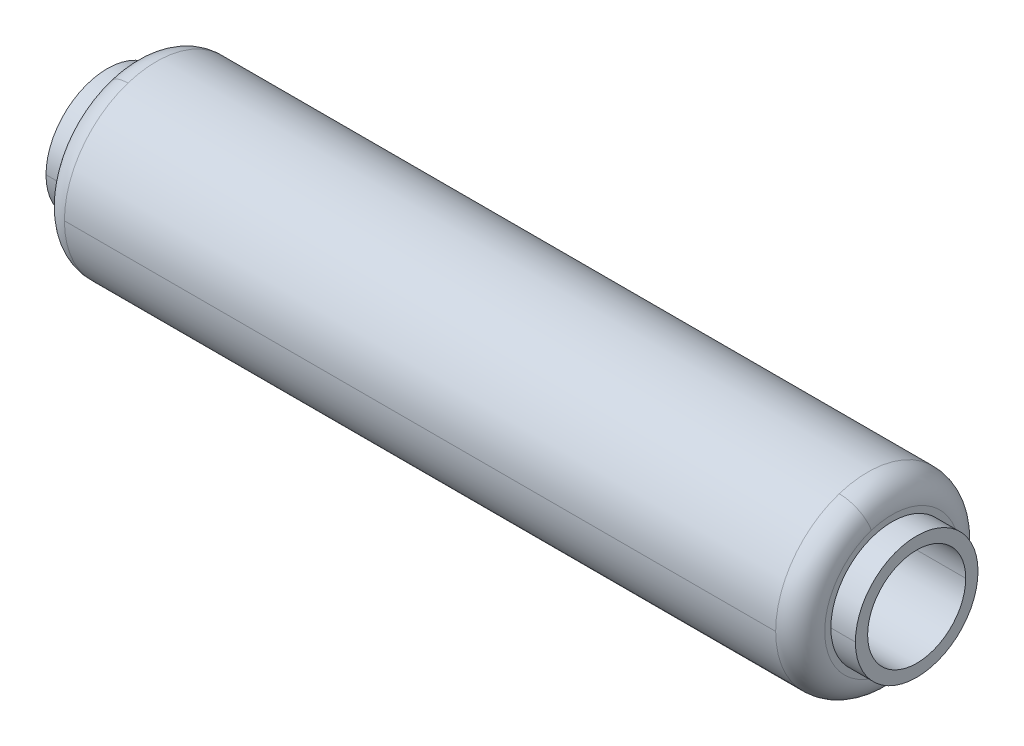
ISO-10303-21;
HEADER;
FILE_DESCRIPTION(('STEP AP214'),'2;1');
FILE_NAME('part.step','',(''),(''),'','','');
FILE_SCHEMA(('AUTOMOTIVE_DESIGN { 1 0 10303 214 1 1 1 1 }'));
ENDSEC;
DATA;
#1=APPLICATION_CONTEXT('core data for automotive mechanical design processes');
#2=APPLICATION_PROTOCOL_DEFINITION('international standard','automotive_design',2000,#1);
#3=PRODUCT_CONTEXT('',#1,'mechanical');
#4=PRODUCT('Part','Part','',(#3));
#5=PRODUCT_RELATED_PRODUCT_CATEGORY('part','',(#4));
#6=PRODUCT_DEFINITION_FORMATION('','',#4);
#7=PRODUCT_DEFINITION_CONTEXT('part definition',#1,'design');
#8=PRODUCT_DEFINITION('design','',#6,#7);
#9=PRODUCT_DEFINITION_SHAPE('','',#8);
#10=(LENGTH_UNIT() NAMED_UNIT(*) SI_UNIT(.MILLI.,.METRE.));
#11=(NAMED_UNIT(*) PLANE_ANGLE_UNIT() SI_UNIT($,.RADIAN.));
#12=(NAMED_UNIT(*) SI_UNIT($,.STERADIAN.) SOLID_ANGLE_UNIT());
#13=UNCERTAINTY_MEASURE_WITH_UNIT(LENGTH_MEASURE(1.E-05),#10,'distance_accuracy_value','');
#14=(GEOMETRIC_REPRESENTATION_CONTEXT(3) GLOBAL_UNCERTAINTY_ASSIGNED_CONTEXT((#13)) GLOBAL_UNIT_ASSIGNED_CONTEXT((#10,
#11,#12)) REPRESENTATION_CONTEXT('',''));
#15=CARTESIAN_POINT('',(0.,0.,0.));
#16=DIRECTION('',(0.,0.,1.));
#17=DIRECTION('',(1.,0.,0.));
#18=AXIS2_PLACEMENT_3D('',#15,#16,#17);
#19=CARTESIAN_POINT('',(0.,0.,0.));
#20=DIRECTION('',(1.,0.,0.));
#21=DIRECTION('',(0.,1.,0.));
#22=AXIS2_PLACEMENT_3D('',#19,#20,#21);
#23=CYLINDRICAL_SURFACE('',#22,5.);
#24=DIRECTION('',(1.,0.,0.));
#25=VECTOR('',#24,1.);
#26=CARTESIAN_POINT('',(-66.,0.,5.));
#27=LINE('',#26,#25);
#28=CARTESIAN_POINT('',(-66.,0.,5.));
#29=VERTEX_POINT('',#28);
#30=CARTESIAN_POINT('',(-64.,0.,5.));
#31=VERTEX_POINT('',#30);
#32=EDGE_CURVE('E11',#29,#31,#27,.T.);
#33=ORIENTED_EDGE('',*,*,#32,.F.);
#34=CARTESIAN_POINT('',(-66.,0.,0.));
#35=DIRECTION('',(1.,0.,0.));
#36=DIRECTION('',(0.,0.,-1.));
#37=AXIS2_PLACEMENT_3D('',#34,#35,#36);
#38=CIRCLE('',#37,5.);
#39=CARTESIAN_POINT('',(-66.,0.,-5.));
#40=VERTEX_POINT('',#39);
#41=EDGE_CURVE('E25',#29,#40,#38,.T.);
#42=ORIENTED_EDGE('',*,*,#41,.T.);
#43=DIRECTION('',(1.,0.,0.));
#44=VECTOR('',#43,1.);
#45=CARTESIAN_POINT('',(-66.,0.,-5.));
#46=LINE('',#45,#44);
#47=CARTESIAN_POINT('',(-64.,0.,-5.));
#48=VERTEX_POINT('',#47);
#49=EDGE_CURVE('E346',#40,#48,#46,.T.);
#50=ORIENTED_EDGE('',*,*,#49,.T.);
#51=CARTESIAN_POINT('',(-64.,0.,0.));
#52=DIRECTION('',(1.,0.,0.));
#53=DIRECTION('',(0.,0.,-1.));
#54=AXIS2_PLACEMENT_3D('',#51,#52,#53);
#55=CIRCLE('',#54,5.);
#56=EDGE_CURVE('E341',#31,#48,#55,.T.);
#57=ORIENTED_EDGE('',*,*,#56,.F.);
#58=EDGE_LOOP('',(#33,#42,#50,#57));
#59=FACE_BOUND('',#58,.T.);
#60=ADVANCED_FACE('F17',(#59),#23,.T.);
#61=CARTESIAN_POINT('',(-64.,5.5,0.));
#62=DIRECTION('',(-1.,0.,0.));
#63=DIRECTION('',(0.,0.,1.));
#64=AXIS2_PLACEMENT_3D('',#61,#62,#63);
#65=PLANE('',#64);
#66=CARTESIAN_POINT('',(-64.,0.,0.));
#67=DIRECTION('',(1.,0.,0.));
#68=DIRECTION('',(0.,0.,-1.));
#69=AXIS2_PLACEMENT_3D('',#66,#67,#68);
#70=CIRCLE('',#69,5.);
#71=EDGE_CURVE('E338',#48,#31,#70,.T.);
#72=ORIENTED_EDGE('',*,*,#71,.T.);
#73=ORIENTED_EDGE('',*,*,#56,.T.);
#74=EDGE_LOOP('',(#72,#73));
#75=FACE_BOUND('',#74,.T.);
#76=CARTESIAN_POINT('',(-64.0000000000001,-5.23081083962321,-1.69959346906218));
#77=CARTESIAN_POINT('',(-64.0000000000001,-5.20300309398906,-1.78518308762216));
#78=CARTESIAN_POINT('',(-64.0000000000001,-5.17309116338424,-1.87008884424513));
#79=CARTESIAN_POINT('',(-64.0000000000001,-5.10913883672672,-2.03833106983937));
#80=CARTESIAN_POINT('',(-64.0000000000001,-5.07509844067402,-2.12166753881065));
#81=CARTESIAN_POINT('',(-64.0000000000001,-5.00296908761421,-2.28656962532382));
#82=CARTESIAN_POINT('',(-64.0000000000001,-4.9648801306071,-2.36813524286571));
#83=CARTESIAN_POINT('',(-64.0000000000001,-4.88474597844831,-2.52929934187434));
#84=CARTESIAN_POINT('',(-64.0000000000001,-4.84270078329662,-2.60889782334107));
#85=CARTESIAN_POINT('',(-64.0000000000001,-4.7547552945039,-2.76593583312532));
#86=CARTESIAN_POINT('',(-64.0000000000001,-4.70885500086287,-2.84337536144283));
#87=CARTESIAN_POINT('',(-64.0000000000001,-4.61330993335347,-2.99590892169164));
#88=CARTESIAN_POINT('',(-64.0000000000001,-4.5636651594851,-3.07100295362294));
#89=CARTESIAN_POINT('',(-64.0000000000001,-4.46075071929532,-3.21866460888066));
#90=CARTESIAN_POINT('',(-64.0000000000001,-4.40748105297391,-3.29123223220707));
#91=CARTESIAN_POINT('',(-64.0000000000001,-4.29744516207313,-3.43366624959776));
#92=CARTESIAN_POINT('',(-64.0000000000001,-4.24067893749376,-3.50353264366202));
#93=CARTESIAN_POINT('',(-64.0000000000001,-4.12378668410636,-3.64039588796984));
#94=CARTESIAN_POINT('',(-64.0000000000001,-4.06366065529831,-3.70739273821339));
#95=CARTESIAN_POINT('',(-64.0000000000001,-3.9401936425318,-3.83835549367855));
#96=CARTESIAN_POINT('',(-64.0000000000001,-3.87685265857332,-3.90232139890016));
#97=CARTESIAN_POINT('',(-64.0000000000001,-3.74710832942847,-4.02706816483176));
#98=CARTESIAN_POINT('',(-64.0000000000001,-3.68070498424209,-4.08784902554176));
#99=CARTESIAN_POINT('',(-64.0000000000001,-3.54499590413118,-4.20607927603861));
#100=CARTESIAN_POINT('',(-64.0000000000001,-3.47569016920665,-4.26352866582546));
#101=CARTESIAN_POINT('',(-64.0000000000001,-3.33434327320134,-4.37495757386253));
#102=CARTESIAN_POINT('',(-64.0000000000001,-3.26230211212056,-4.42893709211274));
#103=CARTESIAN_POINT('',(-64.0000000000001,-3.11565791727092,-4.53329621568943));
#104=CARTESIAN_POINT('',(-64.0000000000001,-3.04105488350206,-4.5836758210159));
#105=CARTESIAN_POINT('',(-64.0000000000001,-2.88946666851878,-4.68071374986303));
#106=CARTESIAN_POINT('',(-64.0000000000001,-2.81248148730436,-4.72737207338368));
#107=CARTESIAN_POINT('',(-64.0000000000001,-2.65631444147469,-4.81685503463107));
#108=CARTESIAN_POINT('',(-64.0000000000001,-2.57713257685944,-4.85967967235779));
#109=CARTESIAN_POINT('',(-64.0000000000001,-2.41676292027544,-4.94139209371402));
#110=CARTESIAN_POINT('',(-64.0000000000001,-2.33557512830671,-4.98027987734352));
#111=CARTESIAN_POINT('',(-64.0000000000001,-2.17138920551782,-5.05402490642838));
#112=CARTESIAN_POINT('',(-64.0000000000001,-2.08839107469767,-5.08888215188373));
#113=CARTESIAN_POINT('',(-64.0000000000001,-1.92078442397287,-5.15448213046286));
#114=CARTESIAN_POINT('',(-64.0000000000001,-1.83617590406822,-5.18522486358662));
#115=CARTESIAN_POINT('',(-64.0000000000001,-1.66555230450972,-5.24252175556573));
#116=CARTESIAN_POINT('',(-64.0000000000001,-1.57953722485587,-5.26907591442108));
#117=CARTESIAN_POINT('',(-64.0000000000001,-1.40630772365986,-5.31793168656878));
#118=CARTESIAN_POINT('',(-64.0000000000001,-1.31909330211771,-5.34023329986115));
#119=CARTESIAN_POINT('',(-64.0000000000001,-1.1436752243257,-5.38053025434308));
#120=CARTESIAN_POINT('',(-64.0000000000001,-1.05547156807583,-5.39852559553266));
#121=CARTESIAN_POINT('',(-64.0000000000001,-0.878287511202014,-5.43016665345588));
#122=CARTESIAN_POINT('',(-64.0000000000001,-0.789307110578063,-5.44381237018953));
#123=CARTESIAN_POINT('',(-64.0000000000001,-0.610783926534943,-5.46672130547408));
#124=CARTESIAN_POINT('',(-64.0000000000001,-0.521241143115774,-5.47598452402497));
#125=CARTESIAN_POINT('',(-64.0000000000001,-0.341808909890495,-5.49010614703916));
#126=CARTESIAN_POINT('',(-64.0000000000001,-0.251919460084384,-5.49496455150244));
#127=CARTESIAN_POINT('',(-64.0000000000001,-0.0720104456431948,-5.50026484201951));
#128=CARTESIAN_POINT('',(-64.0000000000001,0.0180091189918844,-5.50070672807329));
#129=CARTESIAN_POINT('',(-64.0000000000001,0.197961498075026,-5.49717291722914));
#130=CARTESIAN_POINT('',(-64.0000000000001,0.287894312523088,-5.49319722033121));
#131=CARTESIAN_POINT('',(-64.0000000000001,0.467456535205006,-5.48083782138569));
#132=CARTESIAN_POINT('',(-64.0000000000001,0.557085943438861,-5.4724541193381));
#133=CARTESIAN_POINT('',(-64.0000000000001,0.73582542859732,-5.45129890716582));
#134=CARTESIAN_POINT('',(-64.0000000000001,0.824935505521924,-5.43852739704113));
#135=CARTESIAN_POINT('',(-64.0000000000001,1.00242165408145,-5.40862733640119));
#136=CARTESIAN_POINT('',(-64.0000000000001,1.09079772571637,-5.39149878588595));
#137=CARTESIAN_POINT('',(-64.0000000000001,1.26660295799913,-5.35292590864338));
#138=CARTESIAN_POINT('',(-64.0000000000001,1.35403211864697,-5.33148158191605));
#139=CARTESIAN_POINT('',(-64.0000000000001,1.52773290444967,-5.2843288135107));
#140=CARTESIAN_POINT('',(-64.0000000000001,1.61400452960454,-5.25862037183268));
#141=CARTESIAN_POINT('',(-64.0000000000001,1.7851824085198,-5.20300130741374));
#142=CARTESIAN_POINT('',(-64.0000000000001,1.87008866228019,-5.17309068467282));
#143=CARTESIAN_POINT('',(-64.0000000000001,2.03833125180428,-5.10913931543813));
#144=CARTESIAN_POINT('',(-64.0000000000001,2.12166758756799,-5.07509856894436));
#145=CARTESIAN_POINT('',(-64.0000000000001,2.28656957656645,-5.00296895934388));
#146=CARTESIAN_POINT('',(-64.0000000000001,2.3681352298012,-4.96488009623717));
#147=CARTESIAN_POINT('',(-64.0000000000001,2.52929935493882,-4.88474601281824));
#148=CARTESIAN_POINT('',(-64.0000000000001,2.60889782684168,-4.84270079250602));
#149=CARTESIAN_POINT('',(-64.0000000000001,2.76593582962468,-4.75475528529451));
#150=CARTESIAN_POINT('',(-64.0000000000001,2.84337536050483,-4.70885499839522));
#151=CARTESIAN_POINT('',(-64.0000000000001,2.99590892262962,-4.61330993582112));
#152=CARTESIAN_POINT('',(-64.0000000000001,3.07100295387426,-4.56366516014631));
#153=CARTESIAN_POINT('',(-64.0000000000001,3.21866460862931,-4.46075071863412));
#154=CARTESIAN_POINT('',(-64.0000000000001,3.29123223213972,-4.40748105279674));
#155=CARTESIAN_POINT('',(-64.0000000000001,3.43366624966509,-4.2974451622503));
#156=CARTESIAN_POINT('',(-64.0000000000001,3.50353264368005,-4.24067893754124));
#157=CARTESIAN_POINT('',(-64.0000000000001,3.64039588795178,-4.12378668405889));
#158=CARTESIAN_POINT('',(-64.0000000000001,3.70739273820855,-4.0636606552856));
#159=CARTESIAN_POINT('',(-64.0000000000001,3.83835549368338,-3.94019364254453));
#160=CARTESIAN_POINT('',(-64.0000000000001,3.90232139890144,-3.87685265857674));
#161=CARTESIAN_POINT('',(-64.0000000000001,4.02706816483045,-3.74710832942507));
#162=CARTESIAN_POINT('',(-64.0000000000001,4.0878490255414,-3.68070498424118));
#163=CARTESIAN_POINT('',(-64.0000000000001,4.20607927603894,-3.5449959041321));
#164=CARTESIAN_POINT('',(-64.0000000000001,4.26352866582554,-3.4756901692069));
#165=CARTESIAN_POINT('',(-64.0000000000001,4.37495757386242,-3.33434327320111));
#166=CARTESIAN_POINT('',(-64.0000000000001,4.42893709211271,-3.2623021121205));
#167=CARTESIAN_POINT('',(-64.0000000000001,4.53329621568944,-3.115657917271));
#168=CARTESIAN_POINT('',(-64.0000000000001,4.5836758210159,-3.04105488350209));
#169=CARTESIAN_POINT('',(-64.0000000000001,4.68071374986301,-2.88946666851878));
#170=CARTESIAN_POINT('',(-64.0000000000001,4.72737207338367,-2.81248148730437));
#171=CARTESIAN_POINT('',(-64.0000000000001,4.81685503463106,-2.65631444147471));
#172=CARTESIAN_POINT('',(-64.0000000000001,4.85967967235778,-2.57713257685945));
#173=CARTESIAN_POINT('',(-64.0000000000001,4.94139209371401,-2.41676292027546));
#174=CARTESIAN_POINT('',(-64.0000000000001,4.98027987734351,-2.33557512830672));
#175=CARTESIAN_POINT('',(-64.0000000000001,5.05402490642838,-2.17138920551783));
#176=CARTESIAN_POINT('',(-64.0000000000001,5.08888215188374,-2.08839107469767));
#177=CARTESIAN_POINT('',(-64.0000000000001,5.15448213046283,-1.92078442397289));
#178=CARTESIAN_POINT('',(-64.0000000000001,5.18522486358655,-1.83617590406826));
#179=CARTESIAN_POINT('',(-64.0000000000001,5.24252175556579,-1.66555230450972));
#180=CARTESIAN_POINT('',(-64.0000000000001,5.26907591442132,-1.57953722485581));
#181=CARTESIAN_POINT('',(-64.0000000000001,5.31793168656852,-1.40630772365995));
#182=CARTESIAN_POINT('',(-64.0000000000001,5.3402332998602,-1.31909330211798));
#183=CARTESIAN_POINT('',(-64.0000000000001,5.38053025434402,-1.14367522432546));
#184=CARTESIAN_POINT('',(-64.0000000000001,5.39852559553617,-1.05547156807489));
#185=CARTESIAN_POINT('',(-64.0000000000001,5.43016665345236,-0.878287511202984));
#186=CARTESIAN_POINT('',(-64.0000000000001,5.4438123701764,-0.789307110581643));
#187=CARTESIAN_POINT('',(-64.0000000000001,5.46672130548721,-0.610783926531393));
#188=CARTESIAN_POINT('',(-64.0000000000001,5.47598452407398,-0.521241143102484));
#189=CARTESIAN_POINT('',(-64.0000000000001,5.49010614699014,-0.341808909903816));
#190=CARTESIAN_POINT('',(-64.0000000000001,5.49496455131952,-0.251919460134057));
#191=CARTESIAN_POINT('',(-64.0000000000001,5.50026484220243,-0.0720104455935592));
#192=CARTESIAN_POINT('',(-64.0000000000001,5.50070672875595,0.0180091191771794));
#193=CARTESIAN_POINT('',(-64.0000000000001,5.49717291654648,0.197961497889694));
#194=CARTESIAN_POINT('',(-64.0000000000001,5.4931972177835,0.287894311831471));
#195=CARTESIAN_POINT('',(-64.0000000000001,5.48083782393339,0.467456535896589));
#196=CARTESIAN_POINT('',(-64.0000000000001,5.47245412884627,0.557085946019932));
#197=CARTESIAN_POINT('',(-64.0000000000001,5.45129889765765,0.735825426016222));
#198=CARTESIAN_POINT('',(-64.0000000000001,5.43852736155615,0.824935495889169));
#199=CARTESIAN_POINT('',(-64.0000000000001,5.40862737188617,1.00242166371418));
#200=CARTESIAN_POINT('',(-64.0000000000001,5.39149891831769,1.09079776166624));
#201=CARTESIAN_POINT('',(-64.0000000000001,5.35292577621164,1.26660292204923));
#202=CARTESIAN_POINT('',(-64.0000000000001,5.33148108767408,1.35403198448016));
#203=CARTESIAN_POINT('',(-64.0000000000001,5.28432930775267,1.52773303861645));
#204=CARTESIAN_POINT('',(-64.0000000000001,5.25862221636882,1.6140050303218));
#205=CARTESIAN_POINT('',(-64.0000000000001,5.23081083962322,1.69959346906215));
#206=B_SPLINE_CURVE_WITH_KNOTS('',3,(#76,#77,#78,#79,#80,#81,#82,#83,#84,#85,#86,#87,#88,#89,
#90,#91,#92,#93,#94,#95,#96,#97,#98,#99,#100,#101,#102,#103,#104,#105,#106,#107,#108,#109,#110,
#111,#112,#113,#114,#115,#116,#117,#118,#119,#120,#121,#122,#123,#124,#125,#126,#127,#128,#129,
#130,#131,#132,#133,#134,#135,#136,#137,#138,#139,#140,#141,#142,#143,#144,#145,#146,#147,#148,
#149,#150,#151,#152,#153,#154,#155,#156,#157,#158,#159,#160,#161,#162,#163,#164,#165,#166,#167,
#168,#169,#170,#171,#172,#173,#174,#175,#176,#177,#178,#179,#180,#181,#182,#183,#184,#185,#186,
#187,#188,#189,#190,#191,#192,#193,#194,#195,#196,#197,#198,#199,#200,#201,#202,#203,#204,#205),
.UNSPECIFIED.,.F.,.F.,(4,2,2,2,2,2,2,2,2,2,2,2,2,2,2,2,2,2,2,2,2,2,2,2,2,2,2,2,2,2,2,2,2,2,2,2,
2,2,2,2,2,2,2,2,2,2,2,2,2,2,2,2,2,2,2,2,2,2,2,2,2,2,2,2,4),(0.,0.269953513752028,
0.539907027504057,0.809860541256084,1.07981405500811,1.34976756876014,1.61972108251217,
1.8896745962642,2.15962811001622,2.42958162376825,2.69953513752028,2.96948865127231,
3.23944216502434,3.50939567877636,3.77934919252839,4.04930270628042,4.31925622003245,
4.58920973378448,4.8591632475365,5.12911676128853,5.39907027504056,5.66902378879259,
5.93897730254462,6.20893081629664,6.47888433004867,6.7488378438007,7.01879135755273,
7.28874487130475,7.55869838505678,7.82865189880881,8.09860541256084,8.36855892631287,
8.6385124400649,8.90846595381692,9.17841946756895,9.44837298132098,9.71832649507301,
9.98828000882503,10.2582335225771,10.5281870363291,10.7981405500811,11.0680940638331,
11.3380475775852,11.6080010913372,11.8779546050892,12.1479081188413,12.4178616325933,
12.6878151463453,12.9577686600973,13.2277221738494,13.4976756876014,13.7676292013534,
14.0375827151054,14.3075362288575,14.5774897426095,14.8474432563615,15.1173967701136,
15.3873502838656,15.6573037976176,15.9272573113696,16.1972108251217,16.4671643388737,
16.7371178526257,17.0070713663778,17.2770248801298),.UNSPECIFIED.);
#207=CARTESIAN_POINT('',(-64.0000000000001,-5.23081083962321,-1.69959346906217));
#208=VERTEX_POINT('',#207);
#209=CARTESIAN_POINT('',(-64.0000000000001,5.23081083962321,1.69959346906217));
#210=VERTEX_POINT('',#209);
#211=EDGE_CURVE('E337',#208,#210,#206,.T.);
#212=ORIENTED_EDGE('',*,*,#211,.F.);
#213=CARTESIAN_POINT('',(-64.0000000000001,5.23081083962321,1.69959346906218));
#214=CARTESIAN_POINT('',(-64.0000000000001,5.20300309398906,1.78518308762216));
#215=CARTESIAN_POINT('',(-64.0000000000001,5.17309116338424,1.87008884424513));
#216=CARTESIAN_POINT('',(-64.0000000000001,5.10913883672672,2.03833106983937));
#217=CARTESIAN_POINT('',(-64.0000000000001,5.07509844067402,2.12166753881065));
#218=CARTESIAN_POINT('',(-64.0000000000001,5.00296908761421,2.28656962532382));
#219=CARTESIAN_POINT('',(-64.0000000000001,4.9648801306071,2.36813524286571));
#220=CARTESIAN_POINT('',(-64.0000000000001,4.88474597844831,2.52929934187434));
#221=CARTESIAN_POINT('',(-64.0000000000001,4.84270078329662,2.60889782334107));
#222=CARTESIAN_POINT('',(-64.0000000000001,4.7547552945039,2.76593583312532));
#223=CARTESIAN_POINT('',(-64.0000000000001,4.70885500086287,2.84337536144284));
#224=CARTESIAN_POINT('',(-64.0000000000001,4.61330993335347,2.99590892169165));
#225=CARTESIAN_POINT('',(-64.0000000000001,4.5636651594851,3.07100295362294));
#226=CARTESIAN_POINT('',(-64.0000000000001,4.46075071929531,3.21866460888066));
#227=CARTESIAN_POINT('',(-64.0000000000001,4.4074810529739,3.29123223220708));
#228=CARTESIAN_POINT('',(-64.0000000000001,4.29744516207313,3.43366624959776));
#229=CARTESIAN_POINT('',(-64.0000000000001,4.24067893749376,3.50353264366202));
#230=CARTESIAN_POINT('',(-64.0000000000001,4.12378668410635,3.64039588796984));
#231=CARTESIAN_POINT('',(-64.0000000000001,4.06366065529831,3.7073927382134));
#232=CARTESIAN_POINT('',(-64.0000000000001,3.9401936425318,3.83835549367856));
#233=CARTESIAN_POINT('',(-64.0000000000001,3.87685265857332,3.90232139890016));
#234=CARTESIAN_POINT('',(-64.0000000000001,3.74710832942846,4.02706816483176));
#235=CARTESIAN_POINT('',(-64.0000000000001,3.68070498424208,4.08784902554176));
#236=CARTESIAN_POINT('',(-64.0000000000001,3.54499590413117,4.20607927603861));
#237=CARTESIAN_POINT('',(-64.0000000000001,3.47569016920665,4.26352866582546));
#238=CARTESIAN_POINT('',(-64.0000000000001,3.33434327320134,4.37495757386253));
#239=CARTESIAN_POINT('',(-64.0000000000001,3.26230211212056,4.42893709211274));
#240=CARTESIAN_POINT('',(-64.0000000000001,3.11565791727092,4.53329621568943));
#241=CARTESIAN_POINT('',(-64.0000000000001,3.04105488350206,4.5836758210159));
#242=CARTESIAN_POINT('',(-64.0000000000001,2.88946666851878,4.68071374986303));
#243=CARTESIAN_POINT('',(-64.0000000000001,2.81248148730436,4.72737207338369));
#244=CARTESIAN_POINT('',(-64.0000000000001,2.65631444147468,4.81685503463107));
#245=CARTESIAN_POINT('',(-64.0000000000001,2.57713257685943,4.85967967235779));
#246=CARTESIAN_POINT('',(-64.0000000000001,2.41676292027544,4.94139209371402));
#247=CARTESIAN_POINT('',(-64.0000000000001,2.3355751283067,4.98027987734352));
#248=CARTESIAN_POINT('',(-64.0000000000001,2.17138920551781,5.05402490642838));
#249=CARTESIAN_POINT('',(-64.0000000000001,2.08839107469766,5.08888215188373));
#250=CARTESIAN_POINT('',(-64.0000000000001,1.92078442397286,5.15448213046286));
#251=CARTESIAN_POINT('',(-64.0000000000001,1.83617590406822,5.18522486358663));
#252=CARTESIAN_POINT('',(-64.0000000000001,1.66555230450972,5.24252175556574));
#253=CARTESIAN_POINT('',(-64.0000000000001,1.57953722485586,5.26907591442108));
#254=CARTESIAN_POINT('',(-64.0000000000001,1.40630772365986,5.31793168656878));
#255=CARTESIAN_POINT('',(-64.0000000000001,1.31909330211771,5.34023329986115));
#256=CARTESIAN_POINT('',(-64.0000000000001,1.14367522432569,5.38053025434308));
#257=CARTESIAN_POINT('',(-64.0000000000001,1.05547156807582,5.39852559553266));
#258=CARTESIAN_POINT('',(-64.0000000000001,0.878287511202006,5.43016665345588));
#259=CARTESIAN_POINT('',(-64.0000000000001,0.789307110578055,5.44381237018953));
#260=CARTESIAN_POINT('',(-64.0000000000001,0.610783926534935,5.46672130547408));
#261=CARTESIAN_POINT('',(-64.0000000000001,0.521241143115766,5.47598452402498));
#262=CARTESIAN_POINT('',(-64.0000000000001,0.341808909890488,5.49010614703916));
#263=CARTESIAN_POINT('',(-64.0000000000001,0.251919460084378,5.49496455150245));
#264=CARTESIAN_POINT('',(-64.0000000000001,0.0720104456431886,5.50026484201951));
#265=CARTESIAN_POINT('',(-64.0000000000001,-0.0180091189918914,5.50070672807329));
#266=CARTESIAN_POINT('',(-64.0000000000001,-0.197961498075034,5.49717291722914));
#267=CARTESIAN_POINT('',(-64.0000000000001,-0.287894312523096,5.49319722033121));
#268=CARTESIAN_POINT('',(-64.0000000000001,-0.467456535205014,5.48083782138569));
#269=CARTESIAN_POINT('',(-64.0000000000001,-0.55708594343887,5.4724541193381));
#270=CARTESIAN_POINT('',(-64.0000000000001,-0.73582542859733,5.45129890716582));
#271=CARTESIAN_POINT('',(-64.0000000000001,-0.824935505521934,5.43852739704113));
#272=CARTESIAN_POINT('',(-64.0000000000001,-1.00242165408146,5.40862733640119));
#273=CARTESIAN_POINT('',(-64.0000000000001,-1.09079772571638,5.39149878588595));
#274=CARTESIAN_POINT('',(-64.0000000000001,-1.26660295799914,5.35292590864337));
#275=CARTESIAN_POINT('',(-64.0000000000001,-1.35403211864698,5.33148158191605));
#276=CARTESIAN_POINT('',(-64.0000000000001,-1.52773290444968,5.2843288135107));
#277=CARTESIAN_POINT('',(-64.0000000000001,-1.61400452960455,5.25862037183268));
#278=CARTESIAN_POINT('',(-64.0000000000001,-1.78518240851981,5.20300130741374));
#279=CARTESIAN_POINT('',(-64.0000000000001,-1.8700886622802,5.17309068467282));
#280=CARTESIAN_POINT('',(-64.0000000000001,-2.0383312518043,5.10913931543813));
#281=CARTESIAN_POINT('',(-64.0000000000001,-2.121667587568,5.07509856894436));
#282=CARTESIAN_POINT('',(-64.0000000000001,-2.28656957656646,5.00296895934388));
#283=CARTESIAN_POINT('',(-64.0000000000001,-2.36813522980121,4.96488009623717));
#284=CARTESIAN_POINT('',(-64.0000000000001,-2.52929935493883,4.88474601281824));
#285=CARTESIAN_POINT('',(-64.0000000000001,-2.60889782684169,4.84270079250602));
#286=CARTESIAN_POINT('',(-64.0000000000001,-2.76593582962469,4.7547552852945));
#287=CARTESIAN_POINT('',(-64.0000000000001,-2.84337536050484,4.70885499839522));
#288=CARTESIAN_POINT('',(-64.0000000000001,-2.99590892262963,4.61330993582112));
#289=CARTESIAN_POINT('',(-64.0000000000001,-3.07100295387427,4.5636651601463));
#290=CARTESIAN_POINT('',(-64.0000000000001,-3.21866460862932,4.46075071863411));
#291=CARTESIAN_POINT('',(-64.0000000000001,-3.29123223213973,4.40748105279674));
#292=CARTESIAN_POINT('',(-64.0000000000001,-3.4336662496651,4.2974451622503));
#293=CARTESIAN_POINT('',(-64.0000000000001,-3.50353264368006,4.24067893754123));
#294=CARTESIAN_POINT('',(-64.0000000000001,-3.64039588795179,4.12378668405888));
#295=CARTESIAN_POINT('',(-64.0000000000001,-3.70739273820855,4.06366065528559));
#296=CARTESIAN_POINT('',(-64.0000000000001,-3.83835549368339,3.94019364254452));
#297=CARTESIAN_POINT('',(-64.0000000000001,-3.90232139890145,3.87685265857673));
#298=CARTESIAN_POINT('',(-64.0000000000001,-4.02706816483046,3.74710832942506));
#299=CARTESIAN_POINT('',(-64.0000000000001,-4.08784902554141,3.68070498424117));
#300=CARTESIAN_POINT('',(-64.0000000000001,-4.20607927603895,3.54499590413209));
#301=CARTESIAN_POINT('',(-64.0000000000001,-4.26352866582555,3.47569016920689));
#302=CARTESIAN_POINT('',(-64.0000000000001,-4.37495757386243,3.3343432732011));
#303=CARTESIAN_POINT('',(-64.0000000000001,-4.42893709211271,3.26230211212049));
#304=CARTESIAN_POINT('',(-64.0000000000001,-4.53329621568945,3.11565791727098));
#305=CARTESIAN_POINT('',(-64.0000000000001,-4.5836758210159,3.04105488350208));
#306=CARTESIAN_POINT('',(-64.0000000000001,-4.68071374986302,2.88946666851876));
#307=CARTESIAN_POINT('',(-64.0000000000001,-4.72737207338368,2.81248148730436));
#308=CARTESIAN_POINT('',(-64.0000000000001,-4.81685503463107,2.65631444147469));
#309=CARTESIAN_POINT('',(-64.0000000000001,-4.85967967235779,2.57713257685944));
#310=CARTESIAN_POINT('',(-64.0000000000001,-4.94139209371401,2.41676292027544));
#311=CARTESIAN_POINT('',(-64.0000000000001,-4.98027987734351,2.33557512830671));
#312=CARTESIAN_POINT('',(-64.0000000000001,-5.05402490642838,2.17138920551781));
#313=CARTESIAN_POINT('',(-64.0000000000001,-5.08888215188375,2.08839107469766));
#314=CARTESIAN_POINT('',(-64.0000000000001,-5.15448213046283,1.92078442397287));
#315=CARTESIAN_POINT('',(-64.0000000000001,-5.18522486358655,1.83617590406824));
#316=CARTESIAN_POINT('',(-64.0000000000001,-5.2425217555658,1.6655523045097));
#317=CARTESIAN_POINT('',(-64.0000000000001,-5.26907591442133,1.5795372248558));
#318=CARTESIAN_POINT('',(-64.0000000000001,-5.31793168656853,1.40630772365993));
#319=CARTESIAN_POINT('',(-64.0000000000001,-5.3402332998602,1.31909330211797));
#320=CARTESIAN_POINT('',(-64.0000000000001,-5.38053025434402,1.14367522432544));
#321=CARTESIAN_POINT('',(-64.0000000000001,-5.39852559553617,1.05547156807488));
#322=CARTESIAN_POINT('',(-64.0000000000001,-5.43016665345236,0.878287511202967));
#323=CARTESIAN_POINT('',(-64.0000000000001,-5.4438123701764,0.789307110581624));
#324=CARTESIAN_POINT('',(-64.0000000000001,-5.46672130548721,0.610783926531373));
#325=CARTESIAN_POINT('',(-64.0000000000001,-5.47598452407399,0.521241143102464));
#326=CARTESIAN_POINT('',(-64.0000000000001,-5.49010614699014,0.341808909903796));
#327=CARTESIAN_POINT('',(-64.0000000000001,-5.49496455131953,0.251919460134037));
#328=CARTESIAN_POINT('',(-64.0000000000001,-5.50026484220243,0.0720104455935391));
#329=CARTESIAN_POINT('',(-64.0000000000001,-5.50070672875595,-0.0180091191771997));
#330=CARTESIAN_POINT('',(-64.0000000000001,-5.49717291654648,-0.197961497889715));
#331=CARTESIAN_POINT('',(-64.0000000000001,-5.4931972177835,-0.287894311831491));
#332=CARTESIAN_POINT('',(-64.0000000000001,-5.48083782393339,-0.46745653589661));
#333=CARTESIAN_POINT('',(-64.0000000000001,-5.47245412884627,-0.557085946019952));
#334=CARTESIAN_POINT('',(-64.0000000000001,-5.45129889765764,-0.735825426016242));
#335=CARTESIAN_POINT('',(-64.0000000000001,-5.43852736155615,-0.824935495889189));
#336=CARTESIAN_POINT('',(-64.0000000000001,-5.40862737188617,-1.0024216637142));
#337=CARTESIAN_POINT('',(-64.0000000000001,-5.39149891831768,-1.09079776166626));
#338=CARTESIAN_POINT('',(-64.0000000000001,-5.35292577621164,-1.26660292204925));
#339=CARTESIAN_POINT('',(-64.0000000000001,-5.33148108767408,-1.35403198448018));
#340=CARTESIAN_POINT('',(-64.0000000000001,-5.28432930775267,-1.52773303861647));
#341=CARTESIAN_POINT('',(-64.0000000000001,-5.25862221636882,-1.61400503032182));
#342=CARTESIAN_POINT('',(-64.0000000000001,-5.23081083962321,-1.69959346906217));
#343=B_SPLINE_CURVE_WITH_KNOTS('',3,(#213,#214,#215,#216,#217,#218,#219,#220,#221,#222,#223,
#224,#225,#226,#227,#228,#229,#230,#231,#232,#233,#234,#235,#236,#237,#238,#239,#240,#241,#242,
#243,#244,#245,#246,#247,#248,#249,#250,#251,#252,#253,#254,#255,#256,#257,#258,#259,#260,#261,
#262,#263,#264,#265,#266,#267,#268,#269,#270,#271,#272,#273,#274,#275,#276,#277,#278,#279,#280,
#281,#282,#283,#284,#285,#286,#287,#288,#289,#290,#291,#292,#293,#294,#295,#296,#297,#298,#299,
#300,#301,#302,#303,#304,#305,#306,#307,#308,#309,#310,#311,#312,#313,#314,#315,#316,#317,#318,
#319,#320,#321,#322,#323,#324,#325,#326,#327,#328,#329,#330,#331,#332,#333,#334,#335,#336,#337,
#338,#339,#340,#341,#342),.UNSPECIFIED.,.F.,.F.,(4,2,2,2,2,2,2,2,2,2,2,2,2,2,2,2,2,2,2,2,2,2,2,
2,2,2,2,2,2,2,2,2,2,2,2,2,2,2,2,2,2,2,2,2,2,2,2,2,2,2,2,2,2,2,2,2,2,2,2,2,2,2,2,2,4),(0.,
0.269953513752027,0.539907027504057,0.809860541256085,1.07981405500811,1.34976756876014,
1.61972108251217,1.8896745962642,2.15962811001623,2.42958162376826,2.69953513752028,
2.96948865127231,3.23944216502434,3.50939567877637,3.7793491925284,4.04930270628043,
4.31925622003245,4.58920973378448,4.85916324753651,5.12911676128854,5.39907027504056,
5.66902378879259,5.93897730254462,6.20893081629665,6.47888433004868,6.74883784380071,
7.01879135755273,7.28874487130476,7.55869838505679,7.82865189880882,8.09860541256085,
8.36855892631288,8.6385124400649,8.90846595381693,9.17841946756896,9.44837298132099,
9.71832649507301,9.98828000882505,10.2582335225771,10.5281870363291,10.7981405500811,
11.0680940638332,11.3380475775852,11.6080010913372,11.8779546050892,12.1479081188413,
12.4178616325933,12.6878151463453,12.9577686600973,13.2277221738494,13.4976756876014,
13.7676292013534,14.0375827151055,14.3075362288575,14.5774897426095,14.8474432563615,
15.1173967701136,15.3873502838656,15.6573037976176,15.9272573113697,16.1972108251217,
16.4671643388737,16.7371178526257,17.0070713663778,17.2770248801298),.UNSPECIFIED.);
#344=EDGE_CURVE('E299',#210,#208,#343,.T.);
#345=ORIENTED_EDGE('',*,*,#344,.F.);
#346=EDGE_LOOP('',(#212,#345));
#347=FACE_BOUND('',#346,.T.);
#348=ADVANCED_FACE('F285',(#75,#347),#65,.T.);
#349=CARTESIAN_POINT('',(-62.,0.,0.));
#350=DIRECTION('',(1.,0.,0.));
#351=DIRECTION('',(0.,0.309016994374947,-0.951056516295154));
#352=AXIS2_PLACEMENT_3D('',#349,#350,#351);
#353=TOROIDAL_SURFACE('',#352,5.49999999999986,2.00000000000014);
#354=CARTESIAN_POINT('',(-62.,-5.23081083962321,-1.69959346906217));
#355=DIRECTION('',(0.,0.309016994374947,-0.951056516295154));
#356=DIRECTION('',(0.,-0.951056516295154,-0.309016994374947));
#357=AXIS2_PLACEMENT_3D('',#354,#355,#356);
#358=CIRCLE('',#357,2.00000000000014);
#359=CARTESIAN_POINT('',(-62.,-7.13292387221365,-2.3176274578121));
#360=VERTEX_POINT('',#359);
#361=EDGE_CURVE('E311',#360,#208,#358,.T.);
#362=ORIENTED_EDGE('',*,*,#361,.F.);
#363=CARTESIAN_POINT('',(-62.,0.,0.));
#364=DIRECTION('',(1.,0.,0.));
#365=DIRECTION('',(0.,0.,-1.));
#366=AXIS2_PLACEMENT_3D('',#363,#364,#365);
#367=CIRCLE('',#366,7.5);
#368=CARTESIAN_POINT('',(-62.,0.,7.5));
#369=VERTEX_POINT('',#368);
#370=EDGE_CURVE('E306',#369,#360,#367,.T.);
#371=ORIENTED_EDGE('',*,*,#370,.F.);
#372=CARTESIAN_POINT('',(-62.,0.,0.));
#373=DIRECTION('',(1.,0.,0.));
#374=DIRECTION('',(0.,0.,-1.));
#375=AXIS2_PLACEMENT_3D('',#372,#373,#374);
#376=CIRCLE('',#375,7.5);
#377=CARTESIAN_POINT('',(-62.,7.13292387221365,2.3176274578121));
#378=VERTEX_POINT('',#377);
#379=EDGE_CURVE('E301',#378,#369,#376,.T.);
#380=ORIENTED_EDGE('',*,*,#379,.F.);
#381=CARTESIAN_POINT('',(-62.,5.23081083962321,1.69959346906217));
#382=DIRECTION('',(0.,-0.309016994374947,0.951056516295154));
#383=DIRECTION('',(0.,0.951056516295154,0.309016994374947));
#384=AXIS2_PLACEMENT_3D('',#381,#382,#383);
#385=CIRCLE('',#384,2.00000000000014);
#386=EDGE_CURVE('E261',#378,#210,#385,.T.);
#387=ORIENTED_EDGE('',*,*,#386,.T.);
#388=ORIENTED_EDGE('',*,*,#344,.T.);
#389=EDGE_LOOP('',(#362,#371,#380,#387,#388));
#390=FACE_BOUND('',#389,.T.);
#391=ADVANCED_FACE('F281',(#390),#353,.T.);
#392=CARTESIAN_POINT('',(-62.,0.,0.));
#393=DIRECTION('',(1.,0.,0.));
#394=DIRECTION('',(0.,-0.309016994374947,0.951056516295154));
#395=AXIS2_PLACEMENT_3D('',#392,#393,#394);
#396=TOROIDAL_SURFACE('',#395,5.49999999999986,2.00000000000014);
#397=ORIENTED_EDGE('',*,*,#361,.T.);
#398=ORIENTED_EDGE('',*,*,#211,.T.);
#399=ORIENTED_EDGE('',*,*,#386,.F.);
#400=CARTESIAN_POINT('',(-62.,0.,0.));
#401=DIRECTION('',(1.,0.,0.));
#402=DIRECTION('',(0.,0.,-1.));
#403=AXIS2_PLACEMENT_3D('',#400,#401,#402);
#404=CIRCLE('',#403,7.5);
#405=CARTESIAN_POINT('',(-62.,0.,-7.5));
#406=VERTEX_POINT('',#405);
#407=EDGE_CURVE('E256',#406,#378,#404,.T.);
#408=ORIENTED_EDGE('',*,*,#407,.F.);
#409=CARTESIAN_POINT('',(-62.,0.,0.));
#410=DIRECTION('',(1.,0.,0.));
#411=DIRECTION('',(0.,0.,-1.));
#412=AXIS2_PLACEMENT_3D('',#409,#410,#411);
#413=CIRCLE('',#412,7.5);
#414=EDGE_CURVE('E251',#360,#406,#413,.T.);
#415=ORIENTED_EDGE('',*,*,#414,.F.);
#416=EDGE_LOOP('',(#397,#398,#399,#408,#415));
#417=FACE_BOUND('',#416,.T.);
#418=ADVANCED_FACE('F270',(#417),#396,.T.);
#419=CARTESIAN_POINT('',(0.,0.,0.));
#420=DIRECTION('',(1.,0.,0.));
#421=DIRECTION('',(0.,1.,0.));
#422=AXIS2_PLACEMENT_3D('',#419,#420,#421);
#423=CYLINDRICAL_SURFACE('',#422,7.5);
#424=DIRECTION('',(1.,0.,0.));
#425=VECTOR('',#424,1.);
#426=CARTESIAN_POINT('',(-62.,0.,7.5));
#427=LINE('',#426,#425);
#428=CARTESIAN_POINT('',(-4.,0.,7.5));
#429=VERTEX_POINT('',#428);
#430=EDGE_CURVE('E246',#369,#429,#427,.T.);
#431=ORIENTED_EDGE('',*,*,#430,.F.);
#432=ORIENTED_EDGE('',*,*,#370,.T.);
#433=ORIENTED_EDGE('',*,*,#414,.T.);
#434=DIRECTION('',(1.,0.,0.));
#435=VECTOR('',#434,1.);
#436=CARTESIAN_POINT('',(-62.,0.,-7.5));
#437=LINE('',#436,#435);
#438=CARTESIAN_POINT('',(-4.,0.,-7.5));
#439=VERTEX_POINT('',#438);
#440=EDGE_CURVE('E242',#406,#439,#437,.T.);
#441=ORIENTED_EDGE('',*,*,#440,.T.);
#442=CARTESIAN_POINT('',(-4.,0.,0.));
#443=DIRECTION('',(1.,0.,0.));
#444=DIRECTION('',(0.,0.,-1.));
#445=AXIS2_PLACEMENT_3D('',#442,#443,#444);
#446=CIRCLE('',#445,7.5);
#447=CARTESIAN_POINT('',(-4.,-7.13292387221365,-2.3176274578121));
#448=VERTEX_POINT('',#447);
#449=EDGE_CURVE('E237',#448,#439,#446,.T.);
#450=ORIENTED_EDGE('',*,*,#449,.F.);
#451=CARTESIAN_POINT('',(-4.,0.,0.));
#452=DIRECTION('',(1.,0.,0.));
#453=DIRECTION('',(0.,0.,-1.));
#454=AXIS2_PLACEMENT_3D('',#451,#452,#453);
#455=CIRCLE('',#454,7.5);
#456=EDGE_CURVE('E232',#429,#448,#455,.T.);
#457=ORIENTED_EDGE('',*,*,#456,.F.);
#458=EDGE_LOOP('',(#431,#432,#433,#441,#450,#457));
#459=FACE_BOUND('',#458,.T.);
#460=ADVANCED_FACE('F280',(#459),#423,.T.);
#461=CARTESIAN_POINT('',(-4.,0.,0.));
#462=DIRECTION('',(1.,0.,0.));
#463=DIRECTION('',(0.,0.309016994374947,-0.951056516295154));
#464=AXIS2_PLACEMENT_3D('',#461,#462,#463);
#465=TOROIDAL_SURFACE('',#464,5.5,2.);
#466=CARTESIAN_POINT('',(-4.,-5.23081083962335,-1.69959346906221));
#467=DIRECTION('',(0.,0.309016994374947,-0.951056516295154));
#468=DIRECTION('',(1.,0.,0.));
#469=AXIS2_PLACEMENT_3D('',#466,#467,#468);
#470=CIRCLE('',#469,2.);
#471=CARTESIAN_POINT('',(-2.,-5.23081083962335,-1.69959346906221));
#472=VERTEX_POINT('',#471);
#473=EDGE_CURVE('E228',#472,#448,#470,.T.);
#474=ORIENTED_EDGE('',*,*,#473,.F.);
#475=CARTESIAN_POINT('',(-2.,0.,0.));
#476=DIRECTION('',(1.,0.,0.));
#477=DIRECTION('',(0.,0.,-1.));
#478=AXIS2_PLACEMENT_3D('',#475,#476,#477);
#479=CIRCLE('',#478,5.5);
#480=CARTESIAN_POINT('',(-2.,5.23081083962335,1.69959346906221));
#481=VERTEX_POINT('',#480);
#482=EDGE_CURVE('E224',#481,#472,#479,.T.);
#483=ORIENTED_EDGE('',*,*,#482,.F.);
#484=CARTESIAN_POINT('',(-4.,5.23081083962335,1.69959346906221));
#485=DIRECTION('',(0.,-0.309016994374947,0.951056516295154));
#486=DIRECTION('',(1.,0.,0.));
#487=AXIS2_PLACEMENT_3D('',#484,#485,#486);
#488=CIRCLE('',#487,2.);
#489=CARTESIAN_POINT('',(-4.,7.13292387221365,2.3176274578121));
#490=VERTEX_POINT('',#489);
#491=EDGE_CURVE('E220',#481,#490,#488,.T.);
#492=ORIENTED_EDGE('',*,*,#491,.T.);
#493=CARTESIAN_POINT('',(-4.,0.,0.));
#494=DIRECTION('',(1.,0.,0.));
#495=DIRECTION('',(0.,0.,-1.));
#496=AXIS2_PLACEMENT_3D('',#493,#494,#495);
#497=CIRCLE('',#496,7.5);
#498=EDGE_CURVE('E215',#490,#429,#497,.T.);
#499=ORIENTED_EDGE('',*,*,#498,.T.);
#500=ORIENTED_EDGE('',*,*,#456,.T.);
#501=EDGE_LOOP('',(#474,#483,#492,#499,#500));
#502=FACE_BOUND('',#501,.T.);
#503=ADVANCED_FACE('F400',(#502),#465,.T.);
#504=CARTESIAN_POINT('',(0.,0.,0.));
#505=DIRECTION('',(1.,0.,0.));
#506=DIRECTION('',(0.,-1.,0.));
#507=AXIS2_PLACEMENT_3D('',#504,#505,#506);
#508=CYLINDRICAL_SURFACE('',#507,7.5);
#509=ORIENTED_EDGE('',*,*,#430,.T.);
#510=ORIENTED_EDGE('',*,*,#498,.F.);
#511=CARTESIAN_POINT('',(-4.,0.,0.));
#512=DIRECTION('',(1.,0.,0.));
#513=DIRECTION('',(0.,0.,-1.));
#514=AXIS2_PLACEMENT_3D('',#511,#512,#513);
#515=CIRCLE('',#514,7.5);
#516=EDGE_CURVE('E212',#439,#490,#515,.T.);
#517=ORIENTED_EDGE('',*,*,#516,.F.);
#518=ORIENTED_EDGE('',*,*,#440,.F.);
#519=ORIENTED_EDGE('',*,*,#407,.T.);
#520=ORIENTED_EDGE('',*,*,#379,.T.);
#521=EDGE_LOOP('',(#509,#510,#517,#518,#519,#520));
#522=FACE_BOUND('',#521,.T.);
#523=ADVANCED_FACE('F196',(#522),#508,.T.);
#524=CARTESIAN_POINT('',(-4.,0.,0.));
#525=DIRECTION('',(1.,0.,0.));
#526=DIRECTION('',(0.,-0.309016994374947,0.951056516295154));
#527=AXIS2_PLACEMENT_3D('',#524,#525,#526);
#528=TOROIDAL_SURFACE('',#527,5.5,2.);
#529=ORIENTED_EDGE('',*,*,#473,.T.);
#530=ORIENTED_EDGE('',*,*,#449,.T.);
#531=ORIENTED_EDGE('',*,*,#516,.T.);
#532=ORIENTED_EDGE('',*,*,#491,.F.);
#533=CARTESIAN_POINT('',(-2.,-5.23081083962335,-1.69959346906221));
#534=CARTESIAN_POINT('',(-2.,-4.69636733171791,-3.34217040804436));
#535=CARTESIAN_POINT('',(-2.,-3.51976643402928,-4.77956892892113));
#536=CARTESIAN_POINT('',(-2.,-1.79688409020699,-5.65518590309598));
#537=CARTESIAN_POINT('',(-2.,1.90875666387215,-5.87454896087288));
#538=CARTESIAN_POINT('',(-2.,4.77774463871152,-3.51895953365164));
#539=CARTESIAN_POINT('',(-2.,5.65691099009539,-1.79788568784719));
#540=CARTESIAN_POINT('',(-2.,5.7639194596839,0.0565827987270007));
#541=CARTESIAN_POINT('',(-2.,5.23081083962335,1.69959346906221));
#542=B_SPLINE_CURVE_WITH_KNOTS('',5,(#533,#534,#535,#536,#537,#538,#539,#540,#541),
.UNSPECIFIED.,.F.,.F.,(6,3,6),(0.,1.5707963267949,3.14159265358979),.UNSPECIFIED.);
#543=EDGE_CURVE('E170',#472,#481,#542,.T.);
#544=ORIENTED_EDGE('',*,*,#543,.F.);
#545=EDGE_LOOP('',(#529,#530,#531,#532,#544));
#546=FACE_BOUND('',#545,.T.);
#547=ADVANCED_FACE('F190',(#546),#528,.T.);
#548=CARTESIAN_POINT('',(-2.,5.,0.));
#549=DIRECTION('',(1.,0.,0.));
#550=DIRECTION('',(0.,0.,-1.));
#551=AXIS2_PLACEMENT_3D('',#548,#549,#550);
#552=PLANE('',#551);
#553=ORIENTED_EDGE('',*,*,#482,.T.);
#554=ORIENTED_EDGE('',*,*,#543,.T.);
#555=EDGE_LOOP('',(#553,#554));
#556=FACE_BOUND('',#555,.T.);
#557=CARTESIAN_POINT('',(-2.,0.,0.));
#558=DIRECTION('',(1.,0.,0.));
#559=DIRECTION('',(0.,0.,-1.));
#560=AXIS2_PLACEMENT_3D('',#557,#558,#559);
#561=CIRCLE('',#560,5.);
#562=CARTESIAN_POINT('',(-2.,0.,5.));
#563=VERTEX_POINT('',#562);
#564=CARTESIAN_POINT('',(-2.,0.,-5.));
#565=VERTEX_POINT('',#564);
#566=EDGE_CURVE('E165',#563,#565,#561,.T.);
#567=ORIENTED_EDGE('',*,*,#566,.F.);
#568=CARTESIAN_POINT('',(-2.,0.,0.));
#569=DIRECTION('',(1.,0.,0.));
#570=DIRECTION('',(0.,0.,-1.));
#571=AXIS2_PLACEMENT_3D('',#568,#569,#570);
#572=CIRCLE('',#571,5.);
#573=EDGE_CURVE('E160',#565,#563,#572,.T.);
#574=ORIENTED_EDGE('',*,*,#573,.F.);
#575=EDGE_LOOP('',(#567,#574));
#576=FACE_BOUND('',#575,.T.);
#577=ADVANCED_FACE('F179',(#556,#576),#552,.T.);
#578=CARTESIAN_POINT('',(0.,0.,0.));
#579=DIRECTION('',(1.,0.,0.));
#580=DIRECTION('',(0.,-1.,0.));
#581=AXIS2_PLACEMENT_3D('',#578,#579,#580);
#582=CYLINDRICAL_SURFACE('',#581,5.);
#583=DIRECTION('',(1.,0.,0.));
#584=VECTOR('',#583,1.);
#585=CARTESIAN_POINT('',(-2.,0.,5.));
#586=LINE('',#585,#584);
#587=CARTESIAN_POINT('',(0.,0.,5.));
#588=VERTEX_POINT('',#587);
#589=EDGE_CURVE('E156',#563,#588,#586,.T.);
#590=ORIENTED_EDGE('',*,*,#589,.T.);
#591=CARTESIAN_POINT('',(0.,0.,0.));
#592=DIRECTION('',(1.,0.,0.));
#593=DIRECTION('',(0.,0.,-1.));
#594=AXIS2_PLACEMENT_3D('',#591,#592,#593);
#595=CIRCLE('',#594,5.);
#596=CARTESIAN_POINT('',(0.,0.,-5.));
#597=VERTEX_POINT('',#596);
#598=EDGE_CURVE('E151',#597,#588,#595,.T.);
#599=ORIENTED_EDGE('',*,*,#598,.F.);
#600=DIRECTION('',(1.,0.,0.));
#601=VECTOR('',#600,1.);
#602=CARTESIAN_POINT('',(-2.,0.,-5.));
#603=LINE('',#602,#601);
#604=EDGE_CURVE('E146',#565,#597,#603,.T.);
#605=ORIENTED_EDGE('',*,*,#604,.F.);
#606=ORIENTED_EDGE('',*,*,#573,.T.);
#607=EDGE_LOOP('',(#590,#599,#605,#606));
#608=FACE_BOUND('',#607,.T.);
#609=ADVANCED_FACE('F189',(#608),#582,.T.);
#610=CARTESIAN_POINT('',(0.,0.,0.));
#611=DIRECTION('',(1.,0.,0.));
#612=DIRECTION('',(0.,1.,0.));
#613=AXIS2_PLACEMENT_3D('',#610,#611,#612);
#614=CYLINDRICAL_SURFACE('',#613,5.);
#615=ORIENTED_EDGE('',*,*,#589,.F.);
#616=ORIENTED_EDGE('',*,*,#566,.T.);
#617=ORIENTED_EDGE('',*,*,#604,.T.);
#618=CARTESIAN_POINT('',(0.,0.,0.));
#619=DIRECTION('',(1.,0.,0.));
#620=DIRECTION('',(0.,0.,-1.));
#621=AXIS2_PLACEMENT_3D('',#618,#619,#620);
#622=CIRCLE('',#621,5.);
#623=EDGE_CURVE('E141',#588,#597,#622,.T.);
#624=ORIENTED_EDGE('',*,*,#623,.F.);
#625=EDGE_LOOP('',(#615,#616,#617,#624));
#626=FACE_BOUND('',#625,.T.);
#627=ADVANCED_FACE('F442',(#626),#614,.T.);
#628=CARTESIAN_POINT('',(0.,4.,0.));
#629=DIRECTION('',(1.,0.,0.));
#630=DIRECTION('',(0.,0.,-1.));
#631=AXIS2_PLACEMENT_3D('',#628,#629,#630);
#632=PLANE('',#631);
#633=ORIENTED_EDGE('',*,*,#598,.T.);
#634=ORIENTED_EDGE('',*,*,#623,.T.);
#635=EDGE_LOOP('',(#633,#634));
#636=FACE_BOUND('',#635,.T.);
#637=CARTESIAN_POINT('',(0.,0.,0.));
#638=DIRECTION('',(1.,0.,0.));
#639=DIRECTION('',(0.,0.,-1.));
#640=AXIS2_PLACEMENT_3D('',#637,#638,#639);
#641=CIRCLE('',#640,4.);
#642=CARTESIAN_POINT('',(0.,0.,4.));
#643=VERTEX_POINT('',#642);
#644=CARTESIAN_POINT('',(0.,0.,-4.));
#645=VERTEX_POINT('',#644);
#646=EDGE_CURVE('E117',#643,#645,#641,.T.);
#647=ORIENTED_EDGE('',*,*,#646,.F.);
#648=CARTESIAN_POINT('',(0.,0.,0.));
#649=DIRECTION('',(1.,0.,0.));
#650=DIRECTION('',(0.,0.,-1.));
#651=AXIS2_PLACEMENT_3D('',#648,#649,#650);
#652=CIRCLE('',#651,4.);
#653=EDGE_CURVE('E134',#645,#643,#652,.T.);
#654=ORIENTED_EDGE('',*,*,#653,.F.);
#655=EDGE_LOOP('',(#647,#654));
#656=FACE_BOUND('',#655,.T.);
#657=ADVANCED_FACE('F452',(#636,#656),#632,.T.);
#658=CARTESIAN_POINT('',(0.,0.,0.));
#659=DIRECTION('',(1.,0.,0.));
#660=DIRECTION('',(0.,-1.,0.));
#661=AXIS2_PLACEMENT_3D('',#658,#659,#660);
#662=CYLINDRICAL_SURFACE('',#661,4.);
#663=DIRECTION('',(1.,0.,0.));
#664=VECTOR('',#663,1.);
#665=CARTESIAN_POINT('',(-66.,0.,4.));
#666=LINE('',#665,#664);
#667=CARTESIAN_POINT('',(-66.,0.,4.));
#668=VERTEX_POINT('',#667);
#669=EDGE_CURVE('E109',#668,#643,#666,.T.);
#670=ORIENTED_EDGE('',*,*,#669,.F.);
#671=CARTESIAN_POINT('',(-66.,0.,0.));
#672=DIRECTION('',(1.,0.,0.));
#673=DIRECTION('',(0.,0.,-1.));
#674=AXIS2_PLACEMENT_3D('',#671,#672,#673);
#675=CIRCLE('',#674,4.);
#676=CARTESIAN_POINT('',(-66.,0.,-4.));
#677=VERTEX_POINT('',#676);
#678=EDGE_CURVE('E102',#677,#668,#675,.T.);
#679=ORIENTED_EDGE('',*,*,#678,.F.);
#680=DIRECTION('',(1.,0.,0.));
#681=VECTOR('',#680,1.);
#682=CARTESIAN_POINT('',(-66.,0.,-4.));
#683=LINE('',#682,#681);
#684=EDGE_CURVE('E106',#677,#645,#683,.T.);
#685=ORIENTED_EDGE('',*,*,#684,.T.);
#686=ORIENTED_EDGE('',*,*,#653,.T.);
#687=EDGE_LOOP('',(#670,#679,#685,#686));
#688=FACE_BOUND('',#687,.T.);
#689=ADVANCED_FACE('F104',(#688),#662,.F.);
#690=CARTESIAN_POINT('',(0.,0.,0.));
#691=DIRECTION('',(1.,0.,0.));
#692=DIRECTION('',(0.,1.,0.));
#693=AXIS2_PLACEMENT_3D('',#690,#691,#692);
#694=CYLINDRICAL_SURFACE('',#693,4.);
#695=ORIENTED_EDGE('',*,*,#669,.T.);
#696=ORIENTED_EDGE('',*,*,#646,.T.);
#697=ORIENTED_EDGE('',*,*,#684,.F.);
#698=CARTESIAN_POINT('',(-66.,0.,0.));
#699=DIRECTION('',(1.,0.,0.));
#700=DIRECTION('',(0.,0.,-1.));
#701=AXIS2_PLACEMENT_3D('',#698,#699,#700);
#702=CIRCLE('',#701,4.);
#703=EDGE_CURVE('E116',#668,#677,#702,.T.);
#704=ORIENTED_EDGE('',*,*,#703,.F.);
#705=EDGE_LOOP('',(#695,#696,#697,#704));
#706=FACE_BOUND('',#705,.T.);
#707=ADVANCED_FACE('F115',(#706),#694,.F.);
#708=CARTESIAN_POINT('',(-66.,5.,0.));
#709=DIRECTION('',(-1.,0.,0.));
#710=DIRECTION('',(0.,0.,1.));
#711=AXIS2_PLACEMENT_3D('',#708,#709,#710);
#712=PLANE('',#711);
#713=ORIENTED_EDGE('',*,*,#678,.T.);
#714=ORIENTED_EDGE('',*,*,#703,.T.);
#715=EDGE_LOOP('',(#713,#714));
#716=FACE_BOUND('',#715,.T.);
#717=ORIENTED_EDGE('',*,*,#41,.F.);
#718=CARTESIAN_POINT('',(-66.,0.,0.));
#719=DIRECTION('',(1.,0.,0.));
#720=DIRECTION('',(0.,0.,-1.));
#721=AXIS2_PLACEMENT_3D('',#718,#719,#720);
#722=CIRCLE('',#721,5.);
#723=EDGE_CURVE('E121',#40,#29,#722,.T.);
#724=ORIENTED_EDGE('',*,*,#723,.F.);
#725=EDGE_LOOP('',(#717,#724));
#726=FACE_BOUND('',#725,.T.);
#727=ADVANCED_FACE('F119',(#716,#726),#712,.T.);
#728=CARTESIAN_POINT('',(0.,0.,0.));
#729=DIRECTION('',(1.,0.,0.));
#730=DIRECTION('',(0.,-1.,0.));
#731=AXIS2_PLACEMENT_3D('',#728,#729,#730);
#732=CYLINDRICAL_SURFACE('',#731,5.);
#733=ORIENTED_EDGE('',*,*,#32,.T.);
#734=ORIENTED_EDGE('',*,*,#71,.F.);
#735=ORIENTED_EDGE('',*,*,#49,.F.);
#736=ORIENTED_EDGE('',*,*,#723,.T.);
#737=EDGE_LOOP('',(#733,#734,#735,#736));
#738=FACE_BOUND('',#737,.T.);
#739=ADVANCED_FACE('F357',(#738),#732,.T.);
#740=CLOSED_SHELL('',(#60,#348,#391,#418,#460,#503,#523,#547,#577,#609,#627,#657,#689,#707,#727,#739));
#741=MANIFOLD_SOLID_BREP('B1',#740);
#742=ADVANCED_BREP_SHAPE_REPRESENTATION('',(#18,#741),#14);
#743=SHAPE_DEFINITION_REPRESENTATION(#9,#742);
ENDSEC;
END-ISO-10303-21;
